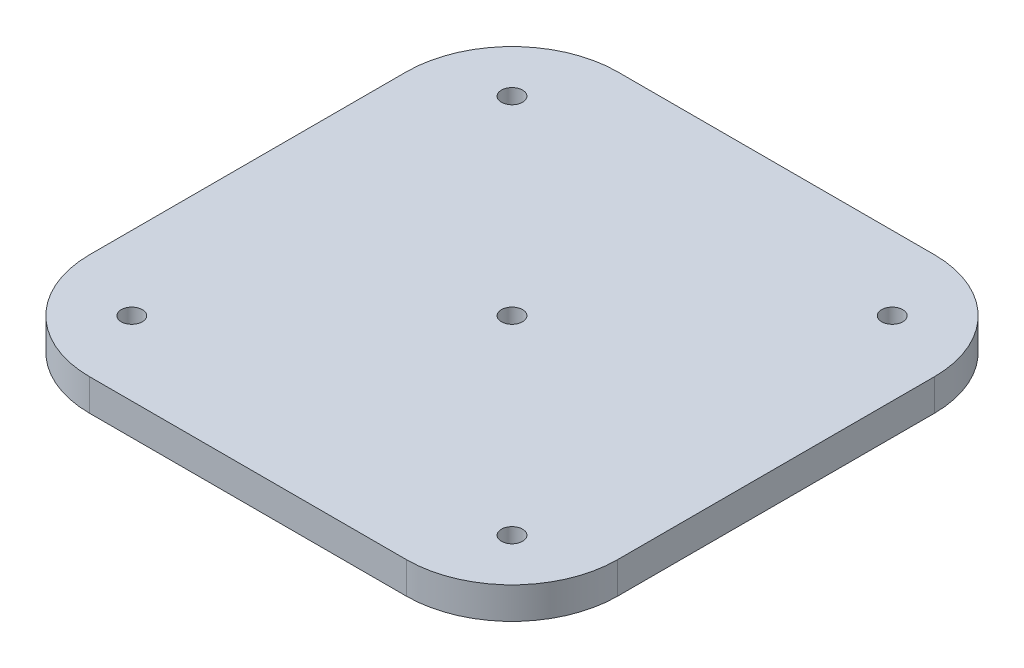
ISO-10303-21;
HEADER;
FILE_DESCRIPTION(('STEP AP214'),'2;1');
FILE_NAME('part.step','',(''),(''),'','','');
FILE_SCHEMA(('AUTOMOTIVE_DESIGN { 1 0 10303 214 1 1 1 1 }'));
ENDSEC;
DATA;
#1=APPLICATION_CONTEXT('core data for automotive mechanical design processes');
#2=APPLICATION_PROTOCOL_DEFINITION('international standard','automotive_design',2000,#1);
#3=PRODUCT_CONTEXT('',#1,'mechanical');
#4=PRODUCT('Part','Part','',(#3));
#5=PRODUCT_RELATED_PRODUCT_CATEGORY('part','',(#4));
#6=PRODUCT_DEFINITION_FORMATION('','',#4);
#7=PRODUCT_DEFINITION_CONTEXT('part definition',#1,'design');
#8=PRODUCT_DEFINITION('design','',#6,#7);
#9=PRODUCT_DEFINITION_SHAPE('','',#8);
#10=(LENGTH_UNIT() NAMED_UNIT(*) SI_UNIT(.MILLI.,.METRE.));
#11=(NAMED_UNIT(*) PLANE_ANGLE_UNIT() SI_UNIT($,.RADIAN.));
#12=(NAMED_UNIT(*) SI_UNIT($,.STERADIAN.) SOLID_ANGLE_UNIT());
#13=UNCERTAINTY_MEASURE_WITH_UNIT(LENGTH_MEASURE(1.E-05),#10,'distance_accuracy_value','');
#14=(GEOMETRIC_REPRESENTATION_CONTEXT(3) GLOBAL_UNCERTAINTY_ASSIGNED_CONTEXT((#13)) GLOBAL_UNIT_ASSIGNED_CONTEXT((#10,
#11,#12)) REPRESENTATION_CONTEXT('',''));
#15=CARTESIAN_POINT('',(0.,0.,0.));
#16=DIRECTION('',(0.,0.,1.));
#17=DIRECTION('',(1.,0.,0.));
#18=AXIS2_PLACEMENT_3D('',#15,#16,#17);
#19=CARTESIAN_POINT('',(13.6430143872078,3.,-15.9498899289545));
#20=DIRECTION('',(0.,1.,0.));
#21=DIRECTION('',(0.,0.,1.));
#22=AXIS2_PLACEMENT_3D('',#19,#20,#21);
#23=PLANE('',#22);
#24=CARTESIAN_POINT('',(-19.3569856127921,3.,17.0501100710455));
#25=DIRECTION('',(0.,1.,0.));
#26=DIRECTION('',(0.,0.,1.));
#27=AXIS2_PLACEMENT_3D('',#24,#25,#26);
#28=CIRCLE('',#27,1.);
#29=CARTESIAN_POINT('',(-19.3569856127921,3.,18.0501100710455));
#30=VERTEX_POINT('',#29);
#31=EDGE_CURVE('E194',#30,#30,#28,.T.);
#32=ORIENTED_EDGE('',*,*,#31,.F.);
#33=EDGE_LOOP('',(#32));
#34=FACE_BOUND('',#33,.T.);
#35=CARTESIAN_POINT('',(16.6430143872078,3.,-18.9498899289545));
#36=DIRECTION('',(0.,1.,0.));
#37=DIRECTION('',(0.,0.,1.));
#38=AXIS2_PLACEMENT_3D('',#35,#36,#37);
#39=CIRCLE('',#38,1.);
#40=CARTESIAN_POINT('',(16.6430143872078,3.,-17.9498899289545));
#41=VERTEX_POINT('',#40);
#42=EDGE_CURVE('E182',#41,#41,#39,.T.);
#43=ORIENTED_EDGE('',*,*,#42,.F.);
#44=EDGE_LOOP('',(#43));
#45=FACE_BOUND('',#44,.T.);
#46=CARTESIAN_POINT('',(13.6430143872078,3.,-15.9498899289545));
#47=DIRECTION('',(0.,1.,0.));
#48=DIRECTION('',(0.,0.,1.));
#49=AXIS2_PLACEMENT_3D('',#46,#47,#48);
#50=CIRCLE('',#49,10.);
#51=CARTESIAN_POINT('',(23.6430143872078,3.,-15.9498899289545));
#52=VERTEX_POINT('',#51);
#53=CARTESIAN_POINT('',(13.6430143872078,3.,-25.9498899289545));
#54=VERTEX_POINT('',#53);
#55=EDGE_CURVE('E145',#52,#54,#50,.T.);
#56=ORIENTED_EDGE('',*,*,#55,.T.);
#57=DIRECTION('',(-1.,0.,0.));
#58=VECTOR('',#57,1.);
#59=CARTESIAN_POINT('',(13.6430143872078,3.,-25.9498899289545));
#60=LINE('',#59,#58);
#61=CARTESIAN_POINT('',(-16.3569856127922,3.,-25.9498899289545));
#62=VERTEX_POINT('',#61);
#63=EDGE_CURVE('E93',#54,#62,#60,.T.);
#64=ORIENTED_EDGE('',*,*,#63,.T.);
#65=CARTESIAN_POINT('',(-16.3569856127922,3.,-15.9498899289545));
#66=DIRECTION('',(0.,1.,0.));
#67=DIRECTION('',(0.,0.,1.));
#68=AXIS2_PLACEMENT_3D('',#65,#66,#67);
#69=CIRCLE('',#68,10.);
#70=CARTESIAN_POINT('',(-26.3569856127922,3.,-15.9498899289545));
#71=VERTEX_POINT('',#70);
#72=EDGE_CURVE('E160',#62,#71,#69,.T.);
#73=ORIENTED_EDGE('',*,*,#72,.T.);
#74=DIRECTION('',(0.,0.,1.));
#75=VECTOR('',#74,1.);
#76=CARTESIAN_POINT('',(-26.3569856127922,3.,-15.9498899289545));
#77=LINE('',#76,#75);
#78=CARTESIAN_POINT('',(-26.3569856127922,3.,14.0501100710455));
#79=VERTEX_POINT('',#78);
#80=EDGE_CURVE('E173',#71,#79,#77,.T.);
#81=ORIENTED_EDGE('',*,*,#80,.T.);
#82=CARTESIAN_POINT('',(-16.3569856127922,3.,14.0501100710455));
#83=DIRECTION('',(0.,1.,0.));
#84=DIRECTION('',(0.,0.,1.));
#85=AXIS2_PLACEMENT_3D('',#82,#83,#84);
#86=CIRCLE('',#85,10.);
#87=CARTESIAN_POINT('',(-16.3569856127922,3.,24.0501100710455));
#88=VERTEX_POINT('',#87);
#89=EDGE_CURVE('E112',#79,#88,#86,.T.);
#90=ORIENTED_EDGE('',*,*,#89,.T.);
#91=DIRECTION('',(1.,0.,0.));
#92=VECTOR('',#91,1.);
#93=CARTESIAN_POINT('',(-16.3569856127922,3.,24.0501100710455));
#94=LINE('',#93,#92);
#95=CARTESIAN_POINT('',(13.6430143872078,3.,24.0501100710455));
#96=VERTEX_POINT('',#95);
#97=EDGE_CURVE('E106',#88,#96,#94,.T.);
#98=ORIENTED_EDGE('',*,*,#97,.T.);
#99=CARTESIAN_POINT('',(13.6430143872078,3.,14.0501100710455));
#100=DIRECTION('',(0.,1.,0.));
#101=DIRECTION('',(0.,0.,1.));
#102=AXIS2_PLACEMENT_3D('',#99,#100,#101);
#103=CIRCLE('',#102,10.);
#104=CARTESIAN_POINT('',(23.6430143872078,3.,14.0501100710455));
#105=VERTEX_POINT('',#104);
#106=EDGE_CURVE('E110',#96,#105,#103,.T.);
#107=ORIENTED_EDGE('',*,*,#106,.T.);
#108=DIRECTION('',(0.,0.,-1.));
#109=VECTOR('',#108,1.);
#110=CARTESIAN_POINT('',(23.6430143872078,3.,14.0501100710455));
#111=LINE('',#110,#109);
#112=EDGE_CURVE('E50',#105,#52,#111,.T.);
#113=ORIENTED_EDGE('',*,*,#112,.T.);
#114=EDGE_LOOP('',(#56,#64,#73,#81,#90,#98,#107,#113));
#115=FACE_BOUND('',#114,.T.);
#116=CARTESIAN_POINT('',(16.6430143872078,3.,17.0501100710455));
#117=DIRECTION('',(0.,1.,0.));
#118=DIRECTION('',(0.,0.,1.));
#119=AXIS2_PLACEMENT_3D('',#116,#117,#118);
#120=CIRCLE('',#119,1.);
#121=CARTESIAN_POINT('',(16.6430143872078,3.,18.0501100710455));
#122=VERTEX_POINT('',#121);
#123=EDGE_CURVE('E134',#122,#122,#120,.T.);
#124=ORIENTED_EDGE('',*,*,#123,.F.);
#125=EDGE_LOOP('',(#124));
#126=FACE_BOUND('',#125,.T.);
#127=CARTESIAN_POINT('',(-19.3569856127921,3.,-18.9498899289545));
#128=DIRECTION('',(0.,1.,0.));
#129=DIRECTION('',(0.,0.,1.));
#130=AXIS2_PLACEMENT_3D('',#127,#128,#129);
#131=CIRCLE('',#130,1.);
#132=CARTESIAN_POINT('',(-19.3569856127921,3.,-17.9498899289545));
#133=VERTEX_POINT('',#132);
#134=EDGE_CURVE('E188',#133,#133,#131,.T.);
#135=ORIENTED_EDGE('',*,*,#134,.F.);
#136=EDGE_LOOP('',(#135));
#137=FACE_BOUND('',#136,.T.);
#138=CARTESIAN_POINT('',(-1.35698561279215,3.,-0.949889928954506));
#139=DIRECTION('',(0.,1.,0.));
#140=DIRECTION('',(0.,0.,1.));
#141=AXIS2_PLACEMENT_3D('',#138,#139,#140);
#142=CIRCLE('',#141,1.);
#143=CARTESIAN_POINT('',(-1.35698561279215,3.,0.0501100710454941));
#144=VERTEX_POINT('',#143);
#145=EDGE_CURVE('E200',#144,#144,#142,.T.);
#146=ORIENTED_EDGE('',*,*,#145,.F.);
#147=EDGE_LOOP('',(#146));
#148=FACE_BOUND('',#147,.T.);
#149=ADVANCED_FACE('F33',(#34,#45,#115,#126,#137,#148),#23,.T.);
#150=CARTESIAN_POINT('',(13.6430143872078,0.,-15.9498899289545));
#151=DIRECTION('',(0.,1.,0.));
#152=DIRECTION('',(0.,0.,1.));
#153=AXIS2_PLACEMENT_3D('',#150,#151,#152);
#154=PLANE('',#153);
#155=CARTESIAN_POINT('',(13.6430143872078,0.,-15.9498899289545));
#156=DIRECTION('',(0.,1.,0.));
#157=DIRECTION('',(0.,0.,1.));
#158=AXIS2_PLACEMENT_3D('',#155,#156,#157);
#159=CIRCLE('',#158,10.);
#160=CARTESIAN_POINT('',(23.6430143872078,0.,-15.9498899289545));
#161=VERTEX_POINT('',#160);
#162=CARTESIAN_POINT('',(13.6430143872078,0.,-25.9498899289545));
#163=VERTEX_POINT('',#162);
#164=EDGE_CURVE('E130',#161,#163,#159,.T.);
#165=ORIENTED_EDGE('',*,*,#164,.F.);
#166=DIRECTION('',(0.,0.,-1.));
#167=VECTOR('',#166,1.);
#168=CARTESIAN_POINT('',(23.6430143872078,0.,14.0501100710455));
#169=LINE('',#168,#167);
#170=CARTESIAN_POINT('',(23.6430143872078,0.,14.0501100710455));
#171=VERTEX_POINT('',#170);
#172=EDGE_CURVE('E85',#171,#161,#169,.T.);
#173=ORIENTED_EDGE('',*,*,#172,.F.);
#174=CARTESIAN_POINT('',(13.6430143872078,0.,14.0501100710455));
#175=DIRECTION('',(0.,1.,0.));
#176=DIRECTION('',(0.,0.,1.));
#177=AXIS2_PLACEMENT_3D('',#174,#175,#176);
#178=CIRCLE('',#177,10.);
#179=CARTESIAN_POINT('',(13.6430143872078,0.,24.0501100710455));
#180=VERTEX_POINT('',#179);
#181=EDGE_CURVE('E79',#180,#171,#178,.T.);
#182=ORIENTED_EDGE('',*,*,#181,.F.);
#183=DIRECTION('',(1.,0.,0.));
#184=VECTOR('',#183,1.);
#185=CARTESIAN_POINT('',(-16.3569856127922,0.,24.0501100710455));
#186=LINE('',#185,#184);
#187=CARTESIAN_POINT('',(-16.3569856127922,0.,24.0501100710455));
#188=VERTEX_POINT('',#187);
#189=EDGE_CURVE('E120',#188,#180,#186,.T.);
#190=ORIENTED_EDGE('',*,*,#189,.F.);
#191=CARTESIAN_POINT('',(-16.3569856127922,0.,14.0501100710455));
#192=DIRECTION('',(0.,1.,0.));
#193=DIRECTION('',(0.,0.,1.));
#194=AXIS2_PLACEMENT_3D('',#191,#192,#193);
#195=CIRCLE('',#194,10.);
#196=CARTESIAN_POINT('',(-26.3569856127922,0.,14.0501100710455));
#197=VERTEX_POINT('',#196);
#198=EDGE_CURVE('E140',#197,#188,#195,.T.);
#199=ORIENTED_EDGE('',*,*,#198,.F.);
#200=DIRECTION('',(0.,0.,1.));
#201=VECTOR('',#200,1.);
#202=CARTESIAN_POINT('',(-26.3569856127922,0.,-15.9498899289545));
#203=LINE('',#202,#201);
#204=CARTESIAN_POINT('',(-26.3569856127922,0.,-15.9498899289545));
#205=VERTEX_POINT('',#204);
#206=EDGE_CURVE('E138',#205,#197,#203,.T.);
#207=ORIENTED_EDGE('',*,*,#206,.F.);
#208=CARTESIAN_POINT('',(-16.3569856127922,0.,-15.9498899289545));
#209=DIRECTION('',(0.,1.,0.));
#210=DIRECTION('',(0.,0.,1.));
#211=AXIS2_PLACEMENT_3D('',#208,#209,#210);
#212=CIRCLE('',#211,10.);
#213=CARTESIAN_POINT('',(-16.3569856127922,0.,-25.9498899289545));
#214=VERTEX_POINT('',#213);
#215=EDGE_CURVE('E136',#214,#205,#212,.T.);
#216=ORIENTED_EDGE('',*,*,#215,.F.);
#217=DIRECTION('',(-1.,0.,0.));
#218=VECTOR('',#217,1.);
#219=CARTESIAN_POINT('',(13.6430143872078,0.,-25.9498899289545));
#220=LINE('',#219,#218);
#221=EDGE_CURVE('E133',#163,#214,#220,.T.);
#222=ORIENTED_EDGE('',*,*,#221,.F.);
#223=EDGE_LOOP('',(#165,#173,#182,#190,#199,#207,#216,#222));
#224=FACE_BOUND('',#223,.T.);
#225=CARTESIAN_POINT('',(16.6430143872078,0.,17.0501100710455));
#226=DIRECTION('',(0.,1.,0.));
#227=DIRECTION('',(0.,0.,1.));
#228=AXIS2_PLACEMENT_3D('',#225,#226,#227);
#229=CIRCLE('',#228,1.);
#230=CARTESIAN_POINT('',(16.6430143872078,0.,18.0501100710455));
#231=VERTEX_POINT('',#230);
#232=EDGE_CURVE('E179',#231,#231,#229,.T.);
#233=ORIENTED_EDGE('',*,*,#232,.T.);
#234=EDGE_LOOP('',(#233));
#235=FACE_BOUND('',#234,.T.);
#236=CARTESIAN_POINT('',(16.6430143872078,0.,-18.9498899289545));
#237=DIRECTION('',(0.,1.,0.));
#238=DIRECTION('',(0.,0.,1.));
#239=AXIS2_PLACEMENT_3D('',#236,#237,#238);
#240=CIRCLE('',#239,1.);
#241=CARTESIAN_POINT('',(16.6430143872078,0.,-17.9498899289545));
#242=VERTEX_POINT('',#241);
#243=EDGE_CURVE('E185',#242,#242,#240,.T.);
#244=ORIENTED_EDGE('',*,*,#243,.T.);
#245=EDGE_LOOP('',(#244));
#246=FACE_BOUND('',#245,.T.);
#247=CARTESIAN_POINT('',(-19.3569856127921,0.,-18.9498899289545));
#248=DIRECTION('',(0.,1.,0.));
#249=DIRECTION('',(0.,0.,1.));
#250=AXIS2_PLACEMENT_3D('',#247,#248,#249);
#251=CIRCLE('',#250,1.);
#252=CARTESIAN_POINT('',(-19.3569856127921,0.,-17.9498899289545));
#253=VERTEX_POINT('',#252);
#254=EDGE_CURVE('E191',#253,#253,#251,.T.);
#255=ORIENTED_EDGE('',*,*,#254,.T.);
#256=EDGE_LOOP('',(#255));
#257=FACE_BOUND('',#256,.T.);
#258=CARTESIAN_POINT('',(-19.3569856127921,0.,17.0501100710455));
#259=DIRECTION('',(0.,1.,0.));
#260=DIRECTION('',(0.,0.,1.));
#261=AXIS2_PLACEMENT_3D('',#258,#259,#260);
#262=CIRCLE('',#261,1.);
#263=CARTESIAN_POINT('',(-19.3569856127921,0.,18.0501100710455));
#264=VERTEX_POINT('',#263);
#265=EDGE_CURVE('E197',#264,#264,#262,.T.);
#266=ORIENTED_EDGE('',*,*,#265,.T.);
#267=EDGE_LOOP('',(#266));
#268=FACE_BOUND('',#267,.T.);
#269=CARTESIAN_POINT('',(-1.35698561279215,0.,-0.949889928954506));
#270=DIRECTION('',(0.,1.,0.));
#271=DIRECTION('',(0.,0.,1.));
#272=AXIS2_PLACEMENT_3D('',#269,#270,#271);
#273=CIRCLE('',#272,1.);
#274=CARTESIAN_POINT('',(-1.35698561279215,0.,0.0501100710454941));
#275=VERTEX_POINT('',#274);
#276=EDGE_CURVE('E203',#275,#275,#273,.T.);
#277=ORIENTED_EDGE('',*,*,#276,.T.);
#278=EDGE_LOOP('',(#277));
#279=FACE_BOUND('',#278,.T.);
#280=ADVANCED_FACE('F164',(#224,#235,#246,#257,#268,#279),#154,.F.);
#281=CARTESIAN_POINT('',(13.6430143872078,3.,-15.9498899289545));
#282=DIRECTION('',(0.,-1.,0.));
#283=DIRECTION('',(0.,0.,-1.));
#284=AXIS2_PLACEMENT_3D('',#281,#282,#283);
#285=CYLINDRICAL_SURFACE('',#284,10.);
#286=ORIENTED_EDGE('',*,*,#164,.T.);
#287=DIRECTION('',(0.,-1.,0.));
#288=VECTOR('',#287,1.);
#289=CARTESIAN_POINT('',(13.6430143872078,3.,-25.9498899289545));
#290=LINE('',#289,#288);
#291=EDGE_CURVE('E11',#54,#163,#290,.T.);
#292=ORIENTED_EDGE('',*,*,#291,.F.);
#293=ORIENTED_EDGE('',*,*,#55,.F.);
#294=DIRECTION('',(0.,-1.,0.));
#295=VECTOR('',#294,1.);
#296=CARTESIAN_POINT('',(23.6430143872078,3.,-15.9498899289545));
#297=LINE('',#296,#295);
#298=EDGE_CURVE('E126',#52,#161,#297,.T.);
#299=ORIENTED_EDGE('',*,*,#298,.T.);
#300=EDGE_LOOP('',(#286,#292,#293,#299));
#301=FACE_BOUND('',#300,.T.);
#302=ADVANCED_FACE('F35',(#301),#285,.T.);
#303=CARTESIAN_POINT('',(13.6430143872078,3.,-25.9498899289545));
#304=DIRECTION('',(0.,0.,1.));
#305=DIRECTION('',(1.,0.,0.));
#306=AXIS2_PLACEMENT_3D('',#303,#304,#305);
#307=PLANE('',#306);
#308=ORIENTED_EDGE('',*,*,#221,.T.);
#309=DIRECTION('',(0.,-1.,0.));
#310=VECTOR('',#309,1.);
#311=CARTESIAN_POINT('',(-16.3569856127922,3.,-25.9498899289545));
#312=LINE('',#311,#310);
#313=EDGE_CURVE('E42',#62,#214,#312,.T.);
#314=ORIENTED_EDGE('',*,*,#313,.F.);
#315=ORIENTED_EDGE('',*,*,#63,.F.);
#316=ORIENTED_EDGE('',*,*,#291,.T.);
#317=EDGE_LOOP('',(#308,#314,#315,#316));
#318=FACE_BOUND('',#317,.T.);
#319=ADVANCED_FACE('F237',(#318),#307,.F.);
#320=CARTESIAN_POINT('',(-16.3569856127922,3.,-15.9498899289545));
#321=DIRECTION('',(0.,-1.,0.));
#322=DIRECTION('',(0.,0.,-1.));
#323=AXIS2_PLACEMENT_3D('',#320,#321,#322);
#324=CYLINDRICAL_SURFACE('',#323,10.);
#325=ORIENTED_EDGE('',*,*,#215,.T.);
#326=DIRECTION('',(0.,-1.,0.));
#327=VECTOR('',#326,1.);
#328=CARTESIAN_POINT('',(-26.3569856127922,3.,-15.9498899289545));
#329=LINE('',#328,#327);
#330=EDGE_CURVE('E152',#71,#205,#329,.T.);
#331=ORIENTED_EDGE('',*,*,#330,.F.);
#332=ORIENTED_EDGE('',*,*,#72,.F.);
#333=ORIENTED_EDGE('',*,*,#313,.T.);
#334=EDGE_LOOP('',(#325,#331,#332,#333));
#335=FACE_BOUND('',#334,.T.);
#336=ADVANCED_FACE('F158',(#335),#324,.T.);
#337=CARTESIAN_POINT('',(-26.3569856127922,3.,-15.9498899289545));
#338=DIRECTION('',(1.,0.,0.));
#339=DIRECTION('',(0.,0.,-1.));
#340=AXIS2_PLACEMENT_3D('',#337,#338,#339);
#341=PLANE('',#340);
#342=ORIENTED_EDGE('',*,*,#206,.T.);
#343=DIRECTION('',(0.,-1.,0.));
#344=VECTOR('',#343,1.);
#345=CARTESIAN_POINT('',(-26.3569856127922,3.,14.0501100710455));
#346=LINE('',#345,#344);
#347=EDGE_CURVE('E149',#79,#197,#346,.T.);
#348=ORIENTED_EDGE('',*,*,#347,.F.);
#349=ORIENTED_EDGE('',*,*,#80,.F.);
#350=ORIENTED_EDGE('',*,*,#330,.T.);
#351=EDGE_LOOP('',(#342,#348,#349,#350));
#352=FACE_BOUND('',#351,.T.);
#353=ADVANCED_FACE('F169',(#352),#341,.F.);
#354=CARTESIAN_POINT('',(-16.3569856127922,3.,14.0501100710455));
#355=DIRECTION('',(0.,-1.,0.));
#356=DIRECTION('',(0.,0.,-1.));
#357=AXIS2_PLACEMENT_3D('',#354,#355,#356);
#358=CYLINDRICAL_SURFACE('',#357,10.);
#359=ORIENTED_EDGE('',*,*,#198,.T.);
#360=DIRECTION('',(0.,-1.,0.));
#361=VECTOR('',#360,1.);
#362=CARTESIAN_POINT('',(-16.3569856127922,3.,24.0501100710455));
#363=LINE('',#362,#361);
#364=EDGE_CURVE('E121',#88,#188,#363,.T.);
#365=ORIENTED_EDGE('',*,*,#364,.F.);
#366=ORIENTED_EDGE('',*,*,#89,.F.);
#367=ORIENTED_EDGE('',*,*,#347,.T.);
#368=EDGE_LOOP('',(#359,#365,#366,#367));
#369=FACE_BOUND('',#368,.T.);
#370=ADVANCED_FACE('F172',(#369),#358,.T.);
#371=CARTESIAN_POINT('',(-16.3569856127922,3.,24.0501100710455));
#372=DIRECTION('',(0.,0.,-1.));
#373=DIRECTION('',(-1.,0.,0.));
#374=AXIS2_PLACEMENT_3D('',#371,#372,#373);
#375=PLANE('',#374);
#376=ORIENTED_EDGE('',*,*,#189,.T.);
#377=DIRECTION('',(0.,-1.,0.));
#378=VECTOR('',#377,1.);
#379=CARTESIAN_POINT('',(13.6430143872078,3.,24.0501100710455));
#380=LINE('',#379,#378);
#381=EDGE_CURVE('E117',#96,#180,#380,.T.);
#382=ORIENTED_EDGE('',*,*,#381,.F.);
#383=ORIENTED_EDGE('',*,*,#97,.F.);
#384=ORIENTED_EDGE('',*,*,#364,.T.);
#385=EDGE_LOOP('',(#376,#382,#383,#384));
#386=FACE_BOUND('',#385,.T.);
#387=ADVANCED_FACE('F118',(#386),#375,.F.);
#388=CARTESIAN_POINT('',(13.6430143872078,3.,14.0501100710455));
#389=DIRECTION('',(0.,-1.,0.));
#390=DIRECTION('',(0.,0.,-1.));
#391=AXIS2_PLACEMENT_3D('',#388,#389,#390);
#392=CYLINDRICAL_SURFACE('',#391,10.);
#393=ORIENTED_EDGE('',*,*,#181,.T.);
#394=DIRECTION('',(0.,-1.,0.));
#395=VECTOR('',#394,1.);
#396=CARTESIAN_POINT('',(23.6430143872078,3.,14.0501100710455));
#397=LINE('',#396,#395);
#398=EDGE_CURVE('E122',#105,#171,#397,.T.);
#399=ORIENTED_EDGE('',*,*,#398,.F.);
#400=ORIENTED_EDGE('',*,*,#106,.F.);
#401=ORIENTED_EDGE('',*,*,#381,.T.);
#402=EDGE_LOOP('',(#393,#399,#400,#401));
#403=FACE_BOUND('',#402,.T.);
#404=ADVANCED_FACE('F124',(#403),#392,.T.);
#405=CARTESIAN_POINT('',(23.6430143872078,3.,14.0501100710455));
#406=DIRECTION('',(-1.,0.,0.));
#407=DIRECTION('',(0.,0.,1.));
#408=AXIS2_PLACEMENT_3D('',#405,#406,#407);
#409=PLANE('',#408);
#410=ORIENTED_EDGE('',*,*,#172,.T.);
#411=ORIENTED_EDGE('',*,*,#298,.F.);
#412=ORIENTED_EDGE('',*,*,#112,.F.);
#413=ORIENTED_EDGE('',*,*,#398,.T.);
#414=EDGE_LOOP('',(#410,#411,#412,#413));
#415=FACE_BOUND('',#414,.T.);
#416=ADVANCED_FACE('F225',(#415),#409,.F.);
#417=CARTESIAN_POINT('',(16.6430143872078,3.,17.0501100710455));
#418=DIRECTION('',(0.,-1.,0.));
#419=DIRECTION('',(0.,0.,-1.));
#420=AXIS2_PLACEMENT_3D('',#417,#418,#419);
#421=CYLINDRICAL_SURFACE('',#420,1.);
#422=ORIENTED_EDGE('',*,*,#123,.T.);
#423=EDGE_LOOP('',(#422));
#424=FACE_BOUND('',#423,.T.);
#425=ORIENTED_EDGE('',*,*,#232,.F.);
#426=EDGE_LOOP('',(#425));
#427=FACE_BOUND('',#426,.T.);
#428=ADVANCED_FACE('F222',(#424,#427),#421,.F.);
#429=CARTESIAN_POINT('',(16.6430143872078,3.,-18.9498899289545));
#430=DIRECTION('',(0.,-1.,0.));
#431=DIRECTION('',(0.,0.,-1.));
#432=AXIS2_PLACEMENT_3D('',#429,#430,#431);
#433=CYLINDRICAL_SURFACE('',#432,1.);
#434=ORIENTED_EDGE('',*,*,#42,.T.);
#435=EDGE_LOOP('',(#434));
#436=FACE_BOUND('',#435,.T.);
#437=ORIENTED_EDGE('',*,*,#243,.F.);
#438=EDGE_LOOP('',(#437));
#439=FACE_BOUND('',#438,.T.);
#440=ADVANCED_FACE('F301',(#436,#439),#433,.F.);
#441=CARTESIAN_POINT('',(-19.3569856127921,3.,-18.9498899289545));
#442=DIRECTION('',(0.,-1.,0.));
#443=DIRECTION('',(0.,0.,-1.));
#444=AXIS2_PLACEMENT_3D('',#441,#442,#443);
#445=CYLINDRICAL_SURFACE('',#444,1.);
#446=ORIENTED_EDGE('',*,*,#134,.T.);
#447=EDGE_LOOP('',(#446));
#448=FACE_BOUND('',#447,.T.);
#449=ORIENTED_EDGE('',*,*,#254,.F.);
#450=EDGE_LOOP('',(#449));
#451=FACE_BOUND('',#450,.T.);
#452=ADVANCED_FACE('F309',(#448,#451),#445,.F.);
#453=CARTESIAN_POINT('',(-19.3569856127921,3.,17.0501100710455));
#454=DIRECTION('',(0.,-1.,0.));
#455=DIRECTION('',(0.,0.,-1.));
#456=AXIS2_PLACEMENT_3D('',#453,#454,#455);
#457=CYLINDRICAL_SURFACE('',#456,1.);
#458=ORIENTED_EDGE('',*,*,#31,.T.);
#459=EDGE_LOOP('',(#458));
#460=FACE_BOUND('',#459,.T.);
#461=ORIENTED_EDGE('',*,*,#265,.F.);
#462=EDGE_LOOP('',(#461));
#463=FACE_BOUND('',#462,.T.);
#464=ADVANCED_FACE('F317',(#460,#463),#457,.F.);
#465=CARTESIAN_POINT('',(-1.35698561279215,3.,-0.949889928954506));
#466=DIRECTION('',(0.,-1.,0.));
#467=DIRECTION('',(0.,0.,-1.));
#468=AXIS2_PLACEMENT_3D('',#465,#466,#467);
#469=CYLINDRICAL_SURFACE('',#468,1.);
#470=ORIENTED_EDGE('',*,*,#145,.T.);
#471=EDGE_LOOP('',(#470));
#472=FACE_BOUND('',#471,.T.);
#473=ORIENTED_EDGE('',*,*,#276,.F.);
#474=EDGE_LOOP('',(#473));
#475=FACE_BOUND('',#474,.T.);
#476=ADVANCED_FACE('F209',(#472,#475),#469,.F.);
#477=CLOSED_SHELL('',(#149,#280,#302,#319,#336,#353,#370,#387,#404,#416,#428,#440,#452,#464,#476));
#478=MANIFOLD_SOLID_BREP('B2',#477);
#479=ADVANCED_BREP_SHAPE_REPRESENTATION('',(#18,#478),#14);
#480=SHAPE_DEFINITION_REPRESENTATION(#9,#479);
ENDSEC;
END-ISO-10303-21;
